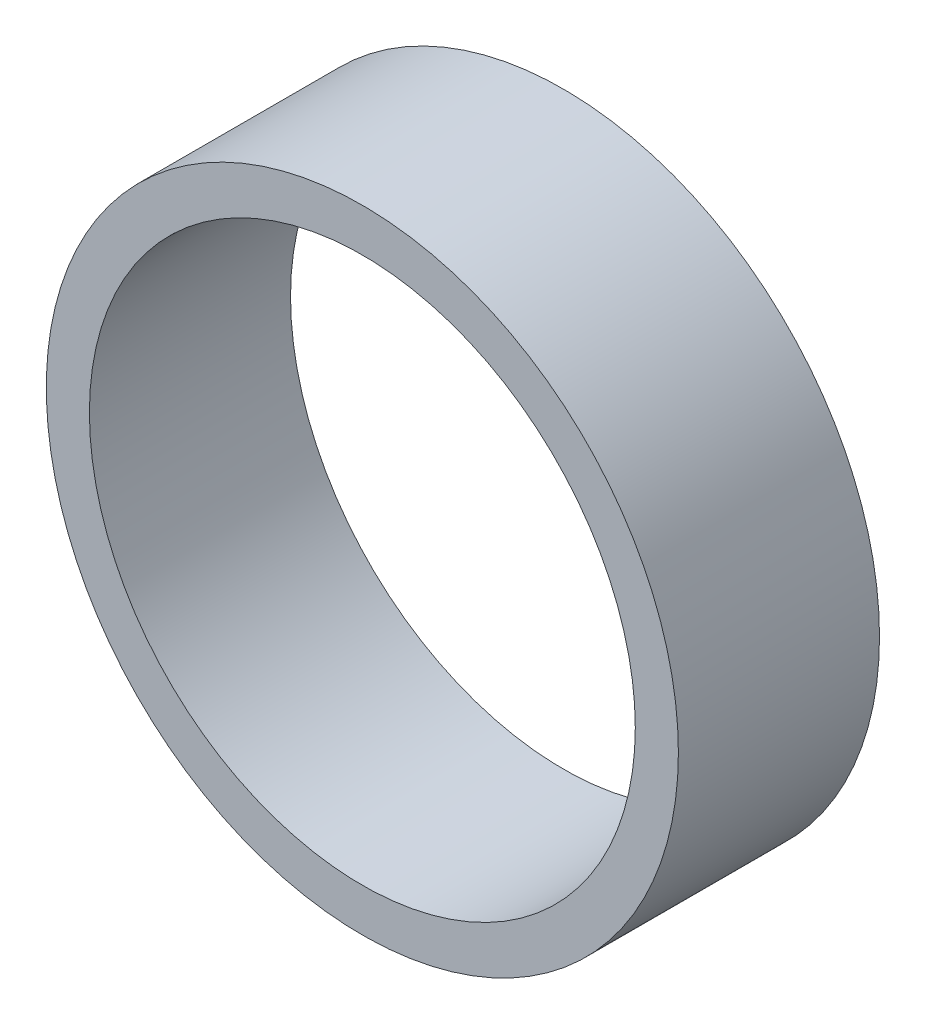
ISO-10303-21;
HEADER;
FILE_DESCRIPTION(('STEP AP214'),'2;1');
FILE_NAME('part.step','',(''),(''),'','','');
FILE_SCHEMA(('AUTOMOTIVE_DESIGN { 1 0 10303 214 1 1 1 1 }'));
ENDSEC;
DATA;
#1=APPLICATION_CONTEXT('core data for automotive mechanical design processes');
#2=APPLICATION_PROTOCOL_DEFINITION('international standard','automotive_design',2000,#1);
#3=PRODUCT_CONTEXT('',#1,'mechanical');
#4=PRODUCT('Part','Part','',(#3));
#5=PRODUCT_RELATED_PRODUCT_CATEGORY('part','',(#4));
#6=PRODUCT_DEFINITION_FORMATION('','',#4);
#7=PRODUCT_DEFINITION_CONTEXT('part definition',#1,'design');
#8=PRODUCT_DEFINITION('design','',#6,#7);
#9=PRODUCT_DEFINITION_SHAPE('','',#8);
#10=(LENGTH_UNIT() NAMED_UNIT(*) SI_UNIT(.MILLI.,.METRE.));
#11=(NAMED_UNIT(*) PLANE_ANGLE_UNIT() SI_UNIT($,.RADIAN.));
#12=(NAMED_UNIT(*) SI_UNIT($,.STERADIAN.) SOLID_ANGLE_UNIT());
#13=UNCERTAINTY_MEASURE_WITH_UNIT(LENGTH_MEASURE(1.E-05),#10,'distance_accuracy_value','');
#14=(GEOMETRIC_REPRESENTATION_CONTEXT(3) GLOBAL_UNCERTAINTY_ASSIGNED_CONTEXT((#13)) GLOBAL_UNIT_ASSIGNED_CONTEXT((#10,
#11,#12)) REPRESENTATION_CONTEXT('',''));
#15=CARTESIAN_POINT('',(0.,0.,0.));
#16=DIRECTION('',(0.,0.,1.));
#17=DIRECTION('',(1.,0.,0.));
#18=AXIS2_PLACEMENT_3D('',#15,#16,#17);
#19=CARTESIAN_POINT('',(0.,0.,7.));
#20=DIRECTION('',(0.,0.,1.));
#21=DIRECTION('',(1.,0.,0.));
#22=AXIS2_PLACEMENT_3D('',#19,#20,#21);
#23=PLANE('',#22);
#24=CARTESIAN_POINT('',(0.,0.,7.));
#25=DIRECTION('',(0.,0.,1.));
#26=DIRECTION('',(1.,0.,0.));
#27=AXIS2_PLACEMENT_3D('',#24,#25,#26);
#28=CIRCLE('',#27,11.);
#29=CARTESIAN_POINT('',(11.,0.,7.));
#30=VERTEX_POINT('',#29);
#31=EDGE_CURVE('E10',#30,#30,#28,.T.);
#32=ORIENTED_EDGE('',*,*,#31,.T.);
#33=EDGE_LOOP('',(#32));
#34=FACE_BOUND('',#33,.T.);
#35=CARTESIAN_POINT('',(0.,0.,7.));
#36=DIRECTION('',(0.,0.,1.));
#37=DIRECTION('',(1.,0.,0.));
#38=AXIS2_PLACEMENT_3D('',#35,#36,#37);
#39=CIRCLE('',#38,9.5);
#40=CARTESIAN_POINT('',(9.5,0.,7.));
#41=VERTEX_POINT('',#40);
#42=EDGE_CURVE('E50',#41,#41,#39,.T.);
#43=ORIENTED_EDGE('',*,*,#42,.F.);
#44=EDGE_LOOP('',(#43));
#45=FACE_BOUND('',#44,.T.);
#46=ADVANCED_FACE('F37',(#34,#45),#23,.T.);
#47=CARTESIAN_POINT('',(0.,0.,0.));
#48=DIRECTION('',(0.,0.,1.));
#49=DIRECTION('',(1.,0.,0.));
#50=AXIS2_PLACEMENT_3D('',#47,#48,#49);
#51=PLANE('',#50);
#52=CARTESIAN_POINT('',(0.,0.,0.));
#53=DIRECTION('',(0.,0.,1.));
#54=DIRECTION('',(1.,0.,0.));
#55=AXIS2_PLACEMENT_3D('',#52,#53,#54);
#56=CIRCLE('',#55,11.);
#57=CARTESIAN_POINT('',(11.,0.,0.));
#58=VERTEX_POINT('',#57);
#59=EDGE_CURVE('E41',#58,#58,#56,.T.);
#60=ORIENTED_EDGE('',*,*,#59,.F.);
#61=EDGE_LOOP('',(#60));
#62=FACE_BOUND('',#61,.T.);
#63=CARTESIAN_POINT('',(0.,0.,0.));
#64=DIRECTION('',(0.,0.,1.));
#65=DIRECTION('',(1.,0.,0.));
#66=AXIS2_PLACEMENT_3D('',#63,#64,#65);
#67=CIRCLE('',#66,9.5);
#68=CARTESIAN_POINT('',(9.5,0.,0.));
#69=VERTEX_POINT('',#68);
#70=EDGE_CURVE('E52',#69,#69,#67,.T.);
#71=ORIENTED_EDGE('',*,*,#70,.T.);
#72=EDGE_LOOP('',(#71));
#73=FACE_BOUND('',#72,.T.);
#74=ADVANCED_FACE('F64',(#62,#73),#51,.F.);
#75=CARTESIAN_POINT('',(0.,0.,7.));
#76=DIRECTION('',(0.,0.,-1.));
#77=DIRECTION('',(-1.,0.,0.));
#78=AXIS2_PLACEMENT_3D('',#75,#76,#77);
#79=CYLINDRICAL_SURFACE('',#78,11.);
#80=ORIENTED_EDGE('',*,*,#31,.F.);
#81=EDGE_LOOP('',(#80));
#82=FACE_BOUND('',#81,.T.);
#83=ORIENTED_EDGE('',*,*,#59,.T.);
#84=EDGE_LOOP('',(#83));
#85=FACE_BOUND('',#84,.T.);
#86=ADVANCED_FACE('F39',(#82,#85),#79,.T.);
#87=CARTESIAN_POINT('',(0.,0.,7.));
#88=DIRECTION('',(0.,0.,-1.));
#89=DIRECTION('',(-1.,0.,0.));
#90=AXIS2_PLACEMENT_3D('',#87,#88,#89);
#91=CYLINDRICAL_SURFACE('',#90,9.5);
#92=ORIENTED_EDGE('',*,*,#42,.T.);
#93=EDGE_LOOP('',(#92));
#94=FACE_BOUND('',#93,.T.);
#95=ORIENTED_EDGE('',*,*,#70,.F.);
#96=EDGE_LOOP('',(#95));
#97=FACE_BOUND('',#96,.T.);
#98=ADVANCED_FACE('F60',(#94,#97),#91,.F.);
#99=CLOSED_SHELL('',(#46,#74,#86,#98));
#100=MANIFOLD_SOLID_BREP('B2',#99);
#101=ADVANCED_BREP_SHAPE_REPRESENTATION('',(#18,#100),#14);
#102=SHAPE_DEFINITION_REPRESENTATION(#9,#101);
ENDSEC;
END-ISO-10303-21;
